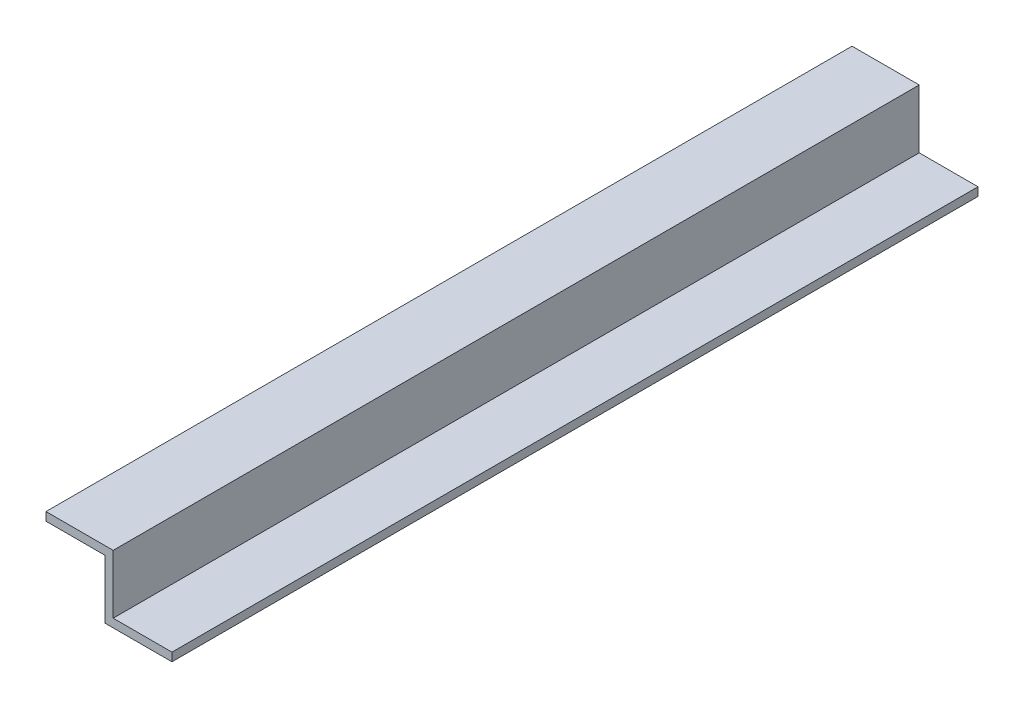
ISO-10303-21;
HEADER;
FILE_DESCRIPTION(('STEP AP214'),'2;1');
FILE_NAME('part.step','',(''),(''),'','','');
FILE_SCHEMA(('AUTOMOTIVE_DESIGN { 1 0 10303 214 1 1 1 1 }'));
ENDSEC;
DATA;
#1=APPLICATION_CONTEXT('core data for automotive mechanical design processes');
#2=APPLICATION_PROTOCOL_DEFINITION('international standard','automotive_design',2000,#1);
#3=PRODUCT_CONTEXT('',#1,'mechanical');
#4=PRODUCT('Part','Part','',(#3));
#5=PRODUCT_RELATED_PRODUCT_CATEGORY('part','',(#4));
#6=PRODUCT_DEFINITION_FORMATION('','',#4);
#7=PRODUCT_DEFINITION_CONTEXT('part definition',#1,'design');
#8=PRODUCT_DEFINITION('design','',#6,#7);
#9=PRODUCT_DEFINITION_SHAPE('','',#8);
#10=(LENGTH_UNIT() NAMED_UNIT(*) SI_UNIT(.MILLI.,.METRE.));
#11=(NAMED_UNIT(*) PLANE_ANGLE_UNIT() SI_UNIT($,.RADIAN.));
#12=(NAMED_UNIT(*) SI_UNIT($,.STERADIAN.) SOLID_ANGLE_UNIT());
#13=UNCERTAINTY_MEASURE_WITH_UNIT(LENGTH_MEASURE(1.E-05),#10,'distance_accuracy_value','');
#14=(GEOMETRIC_REPRESENTATION_CONTEXT(3) GLOBAL_UNCERTAINTY_ASSIGNED_CONTEXT((#13)) GLOBAL_UNIT_ASSIGNED_CONTEXT((#10,
#11,#12)) REPRESENTATION_CONTEXT('',''));
#15=CARTESIAN_POINT('',(0.,0.,0.));
#16=DIRECTION('',(0.,0.,1.));
#17=DIRECTION('',(1.,0.,0.));
#18=AXIS2_PLACEMENT_3D('',#15,#16,#17);
#19=CARTESIAN_POINT('',(1.5875,-9.525,152.4));
#20=DIRECTION('',(0.,-1.,0.));
#21=DIRECTION('',(0.,0.,-1.));
#22=AXIS2_PLACEMENT_3D('',#19,#20,#21);
#23=PLANE('',#22);
#24=DIRECTION('',(0.,0.,-1.));
#25=VECTOR('',#24,1.);
#26=CARTESIAN_POINT('',(23.8125,-9.525,152.4));
#27=LINE('',#26,#25);
#28=CARTESIAN_POINT('',(23.8125,-9.525,152.4));
#29=VERTEX_POINT('',#28);
#30=CARTESIAN_POINT('',(23.8125,-9.525,-152.4));
#31=VERTEX_POINT('',#30);
#32=EDGE_CURVE('E116',#29,#31,#27,.T.);
#33=ORIENTED_EDGE('',*,*,#32,.T.);
#34=DIRECTION('',(-1.,0.,0.));
#35=VECTOR('',#34,1.);
#36=CARTESIAN_POINT('',(1.5875,-9.525,-152.4));
#37=LINE('',#36,#35);
#38=CARTESIAN_POINT('',(1.5875,-9.525,-152.4));
#39=VERTEX_POINT('',#38);
#40=EDGE_CURVE('E110',#31,#39,#37,.T.);
#41=ORIENTED_EDGE('',*,*,#40,.T.);
#42=DIRECTION('',(0.,0.,-1.));
#43=VECTOR('',#42,1.);
#44=CARTESIAN_POINT('',(1.5875,-9.525,152.4));
#45=LINE('',#44,#43);
#46=CARTESIAN_POINT('',(1.5875,-9.525,152.4));
#47=VERTEX_POINT('',#46);
#48=EDGE_CURVE('E11',#47,#39,#45,.T.);
#49=ORIENTED_EDGE('',*,*,#48,.F.);
#50=DIRECTION('',(-1.,0.,0.));
#51=VECTOR('',#50,1.);
#52=CARTESIAN_POINT('',(1.5875,-9.525,152.4));
#53=LINE('',#52,#51);
#54=EDGE_CURVE('E134',#29,#47,#53,.T.);
#55=ORIENTED_EDGE('',*,*,#54,.F.);
#56=EDGE_LOOP('',(#33,#41,#49,#55));
#57=FACE_BOUND('',#56,.T.);
#58=ADVANCED_FACE('F34',(#57),#23,.F.);
#59=CARTESIAN_POINT('',(1.5875,-9.525,152.4));
#60=DIRECTION('',(-1.,0.,0.));
#61=DIRECTION('',(0.,0.,1.));
#62=AXIS2_PLACEMENT_3D('',#59,#60,#61);
#63=PLANE('',#62);
#64=ORIENTED_EDGE('',*,*,#48,.T.);
#65=DIRECTION('',(0.,1.,0.));
#66=VECTOR('',#65,1.);
#67=CARTESIAN_POINT('',(1.5875,-9.525,-152.4));
#68=LINE('',#67,#66);
#69=CARTESIAN_POINT('',(1.5875,12.7,-152.4));
#70=VERTEX_POINT('',#69);
#71=EDGE_CURVE('E100',#39,#70,#68,.T.);
#72=ORIENTED_EDGE('',*,*,#71,.T.);
#73=DIRECTION('',(0.,0.,-1.));
#74=VECTOR('',#73,1.);
#75=CARTESIAN_POINT('',(1.5875,12.7,152.4));
#76=LINE('',#75,#74);
#77=CARTESIAN_POINT('',(1.5875,12.7,152.4));
#78=VERTEX_POINT('',#77);
#79=EDGE_CURVE('E41',#78,#70,#76,.T.);
#80=ORIENTED_EDGE('',*,*,#79,.F.);
#81=DIRECTION('',(0.,1.,0.));
#82=VECTOR('',#81,1.);
#83=CARTESIAN_POINT('',(1.5875,-9.525,152.4));
#84=LINE('',#83,#82);
#85=EDGE_CURVE('E101',#47,#78,#84,.T.);
#86=ORIENTED_EDGE('',*,*,#85,.F.);
#87=EDGE_LOOP('',(#64,#72,#80,#86));
#88=FACE_BOUND('',#87,.T.);
#89=ADVANCED_FACE('F98',(#88),#63,.F.);
#90=CARTESIAN_POINT('',(1.5875,12.7,152.4));
#91=DIRECTION('',(0.,-1.,0.));
#92=DIRECTION('',(0.,0.,-1.));
#93=AXIS2_PLACEMENT_3D('',#90,#91,#92);
#94=PLANE('',#93);
#95=ORIENTED_EDGE('',*,*,#79,.T.);
#96=DIRECTION('',(-1.,0.,0.));
#97=VECTOR('',#96,1.);
#98=CARTESIAN_POINT('',(1.5875,12.7,-152.4));
#99=LINE('',#98,#97);
#100=CARTESIAN_POINT('',(-23.8125,12.7,-152.4));
#101=VERTEX_POINT('',#100);
#102=EDGE_CURVE('E114',#70,#101,#99,.T.);
#103=ORIENTED_EDGE('',*,*,#102,.T.);
#104=DIRECTION('',(0.,0.,-1.));
#105=VECTOR('',#104,1.);
#106=CARTESIAN_POINT('',(-23.8125,12.7,152.4));
#107=LINE('',#106,#105);
#108=CARTESIAN_POINT('',(-23.8125,12.7,152.4));
#109=VERTEX_POINT('',#108);
#110=EDGE_CURVE('E156',#109,#101,#107,.T.);
#111=ORIENTED_EDGE('',*,*,#110,.F.);
#112=DIRECTION('',(-1.,0.,0.));
#113=VECTOR('',#112,1.);
#114=CARTESIAN_POINT('',(1.5875,12.7,152.4));
#115=LINE('',#114,#113);
#116=EDGE_CURVE('E137',#78,#109,#115,.T.);
#117=ORIENTED_EDGE('',*,*,#116,.F.);
#118=EDGE_LOOP('',(#95,#103,#111,#117));
#119=FACE_BOUND('',#118,.T.);
#120=ADVANCED_FACE('F159',(#119),#94,.F.);
#121=CARTESIAN_POINT('',(-23.8125,12.7,152.4));
#122=DIRECTION('',(1.,0.,0.));
#123=DIRECTION('',(0.,0.,-1.));
#124=AXIS2_PLACEMENT_3D('',#121,#122,#123);
#125=PLANE('',#124);
#126=ORIENTED_EDGE('',*,*,#110,.T.);
#127=DIRECTION('',(0.,-1.,0.));
#128=VECTOR('',#127,1.);
#129=CARTESIAN_POINT('',(-23.8125,12.7,-152.4));
#130=LINE('',#129,#128);
#131=CARTESIAN_POINT('',(-23.8125,9.525,-152.4));
#132=VERTEX_POINT('',#131);
#133=EDGE_CURVE('E120',#101,#132,#130,.T.);
#134=ORIENTED_EDGE('',*,*,#133,.T.);
#135=DIRECTION('',(0.,0.,-1.));
#136=VECTOR('',#135,1.);
#137=CARTESIAN_POINT('',(-23.8125,9.525,152.4));
#138=LINE('',#137,#136);
#139=CARTESIAN_POINT('',(-23.8125,9.525,152.4));
#140=VERTEX_POINT('',#139);
#141=EDGE_CURVE('E154',#140,#132,#138,.T.);
#142=ORIENTED_EDGE('',*,*,#141,.F.);
#143=DIRECTION('',(0.,-1.,0.));
#144=VECTOR('',#143,1.);
#145=CARTESIAN_POINT('',(-23.8125,12.7,152.4));
#146=LINE('',#145,#144);
#147=EDGE_CURVE('E139',#109,#140,#146,.T.);
#148=ORIENTED_EDGE('',*,*,#147,.F.);
#149=EDGE_LOOP('',(#126,#134,#142,#148));
#150=FACE_BOUND('',#149,.T.);
#151=ADVANCED_FACE('F167',(#150),#125,.F.);
#152=CARTESIAN_POINT('',(-1.5875,9.525,152.4));
#153=DIRECTION('',(0.,1.,0.));
#154=DIRECTION('',(0.,0.,1.));
#155=AXIS2_PLACEMENT_3D('',#152,#153,#154);
#156=PLANE('',#155);
#157=ORIENTED_EDGE('',*,*,#141,.T.);
#158=DIRECTION('',(1.,0.,0.));
#159=VECTOR('',#158,1.);
#160=CARTESIAN_POINT('',(-1.5875,9.525,-152.4));
#161=LINE('',#160,#159);
#162=CARTESIAN_POINT('',(-1.5875,9.525,-152.4));
#163=VERTEX_POINT('',#162);
#164=EDGE_CURVE('E123',#132,#163,#161,.T.);
#165=ORIENTED_EDGE('',*,*,#164,.T.);
#166=DIRECTION('',(0.,0.,-1.));
#167=VECTOR('',#166,1.);
#168=CARTESIAN_POINT('',(-1.5875,9.525,152.4));
#169=LINE('',#168,#167);
#170=CARTESIAN_POINT('',(-1.5875,9.525,152.4));
#171=VERTEX_POINT('',#170);
#172=EDGE_CURVE('E152',#171,#163,#169,.T.);
#173=ORIENTED_EDGE('',*,*,#172,.F.);
#174=DIRECTION('',(1.,0.,0.));
#175=VECTOR('',#174,1.);
#176=CARTESIAN_POINT('',(-1.5875,9.525,152.4));
#177=LINE('',#176,#175);
#178=EDGE_CURVE('E141',#140,#171,#177,.T.);
#179=ORIENTED_EDGE('',*,*,#178,.F.);
#180=EDGE_LOOP('',(#157,#165,#173,#179));
#181=FACE_BOUND('',#180,.T.);
#182=ADVANCED_FACE('F170',(#181),#156,.F.);
#183=CARTESIAN_POINT('',(-1.5875,-12.7,152.4));
#184=DIRECTION('',(1.,0.,0.));
#185=DIRECTION('',(0.,0.,-1.));
#186=AXIS2_PLACEMENT_3D('',#183,#184,#185);
#187=PLANE('',#186);
#188=ORIENTED_EDGE('',*,*,#172,.T.);
#189=DIRECTION('',(0.,-1.,0.));
#190=VECTOR('',#189,1.);
#191=CARTESIAN_POINT('',(-1.5875,-12.7,-152.4));
#192=LINE('',#191,#190);
#193=CARTESIAN_POINT('',(-1.5875,-12.7,-152.4));
#194=VERTEX_POINT('',#193);
#195=EDGE_CURVE('E126',#163,#194,#192,.T.);
#196=ORIENTED_EDGE('',*,*,#195,.T.);
#197=DIRECTION('',(0.,0.,-1.));
#198=VECTOR('',#197,1.);
#199=CARTESIAN_POINT('',(-1.5875,-12.7,152.4));
#200=LINE('',#199,#198);
#201=CARTESIAN_POINT('',(-1.5875,-12.7,152.4));
#202=VERTEX_POINT('',#201);
#203=EDGE_CURVE('E150',#202,#194,#200,.T.);
#204=ORIENTED_EDGE('',*,*,#203,.F.);
#205=DIRECTION('',(0.,-1.,0.));
#206=VECTOR('',#205,1.);
#207=CARTESIAN_POINT('',(-1.5875,-12.7,152.4));
#208=LINE('',#207,#206);
#209=EDGE_CURVE('E143',#171,#202,#208,.T.);
#210=ORIENTED_EDGE('',*,*,#209,.F.);
#211=EDGE_LOOP('',(#188,#196,#204,#210));
#212=FACE_BOUND('',#211,.T.);
#213=ADVANCED_FACE('F175',(#212),#187,.F.);
#214=CARTESIAN_POINT('',(-1.5875,-12.7,152.4));
#215=DIRECTION('',(0.,1.,0.));
#216=DIRECTION('',(0.,0.,1.));
#217=AXIS2_PLACEMENT_3D('',#214,#215,#216);
#218=PLANE('',#217);
#219=ORIENTED_EDGE('',*,*,#203,.T.);
#220=DIRECTION('',(1.,0.,0.));
#221=VECTOR('',#220,1.);
#222=CARTESIAN_POINT('',(-1.5875,-12.7,-152.4));
#223=LINE('',#222,#221);
#224=CARTESIAN_POINT('',(23.8125,-12.7,-152.4));
#225=VERTEX_POINT('',#224);
#226=EDGE_CURVE('E129',#194,#225,#223,.T.);
#227=ORIENTED_EDGE('',*,*,#226,.T.);
#228=DIRECTION('',(0.,0.,-1.));
#229=VECTOR('',#228,1.);
#230=CARTESIAN_POINT('',(23.8125,-12.7,152.4));
#231=LINE('',#230,#229);
#232=CARTESIAN_POINT('',(23.8125,-12.7,152.4));
#233=VERTEX_POINT('',#232);
#234=EDGE_CURVE('E148',#233,#225,#231,.T.);
#235=ORIENTED_EDGE('',*,*,#234,.F.);
#236=DIRECTION('',(1.,0.,0.));
#237=VECTOR('',#236,1.);
#238=CARTESIAN_POINT('',(-1.5875,-12.7,152.4));
#239=LINE('',#238,#237);
#240=EDGE_CURVE('E53',#202,#233,#239,.T.);
#241=ORIENTED_EDGE('',*,*,#240,.F.);
#242=EDGE_LOOP('',(#219,#227,#235,#241));
#243=FACE_BOUND('',#242,.T.);
#244=ADVANCED_FACE('F178',(#243),#218,.F.);
#245=CARTESIAN_POINT('',(23.8125,-9.525,152.4));
#246=DIRECTION('',(-1.,0.,0.));
#247=DIRECTION('',(0.,0.,1.));
#248=AXIS2_PLACEMENT_3D('',#245,#246,#247);
#249=PLANE('',#248);
#250=ORIENTED_EDGE('',*,*,#234,.T.);
#251=DIRECTION('',(0.,1.,0.));
#252=VECTOR('',#251,1.);
#253=CARTESIAN_POINT('',(23.8125,-9.525,-152.4));
#254=LINE('',#253,#252);
#255=EDGE_CURVE('E132',#225,#31,#254,.T.);
#256=ORIENTED_EDGE('',*,*,#255,.T.);
#257=ORIENTED_EDGE('',*,*,#32,.F.);
#258=DIRECTION('',(0.,1.,0.));
#259=VECTOR('',#258,1.);
#260=CARTESIAN_POINT('',(23.8125,-9.525,152.4));
#261=LINE('',#260,#259);
#262=EDGE_CURVE('E48',#233,#29,#261,.T.);
#263=ORIENTED_EDGE('',*,*,#262,.F.);
#264=EDGE_LOOP('',(#250,#256,#257,#263));
#265=FACE_BOUND('',#264,.T.);
#266=ADVANCED_FACE('F180',(#265),#249,.F.);
#267=CARTESIAN_POINT('',(0.,0.,152.4));
#268=DIRECTION('',(0.,0.,-1.));
#269=DIRECTION('',(-1.,0.,0.));
#270=AXIS2_PLACEMENT_3D('',#267,#268,#269);
#271=PLANE('',#270);
#272=ORIENTED_EDGE('',*,*,#54,.T.);
#273=ORIENTED_EDGE('',*,*,#85,.T.);
#274=ORIENTED_EDGE('',*,*,#116,.T.);
#275=ORIENTED_EDGE('',*,*,#147,.T.);
#276=ORIENTED_EDGE('',*,*,#178,.T.);
#277=ORIENTED_EDGE('',*,*,#209,.T.);
#278=ORIENTED_EDGE('',*,*,#240,.T.);
#279=ORIENTED_EDGE('',*,*,#262,.T.);
#280=EDGE_LOOP('',(#272,#273,#274,#275,#276,#277,#278,#279));
#281=FACE_BOUND('',#280,.T.);
#282=ADVANCED_FACE('F162',(#281),#271,.F.);
#283=CARTESIAN_POINT('',(0.,0.,-152.4));
#284=DIRECTION('',(0.,0.,-1.));
#285=DIRECTION('',(-1.,0.,0.));
#286=AXIS2_PLACEMENT_3D('',#283,#284,#285);
#287=PLANE('',#286);
#288=ORIENTED_EDGE('',*,*,#40,.F.);
#289=ORIENTED_EDGE('',*,*,#255,.F.);
#290=ORIENTED_EDGE('',*,*,#226,.F.);
#291=ORIENTED_EDGE('',*,*,#195,.F.);
#292=ORIENTED_EDGE('',*,*,#164,.F.);
#293=ORIENTED_EDGE('',*,*,#133,.F.);
#294=ORIENTED_EDGE('',*,*,#102,.F.);
#295=ORIENTED_EDGE('',*,*,#71,.F.);
#296=EDGE_LOOP('',(#288,#289,#290,#291,#292,#293,#294,#295));
#297=FACE_BOUND('',#296,.T.);
#298=ADVANCED_FACE('F108',(#297),#287,.T.);
#299=CLOSED_SHELL('',(#58,#89,#120,#151,#182,#213,#244,#266,#282,#298));
#300=MANIFOLD_SOLID_BREP('B2',#299);
#301=ADVANCED_BREP_SHAPE_REPRESENTATION('',(#18,#300),#14);
#302=SHAPE_DEFINITION_REPRESENTATION(#9,#301);
ENDSEC;
END-ISO-10303-21;
